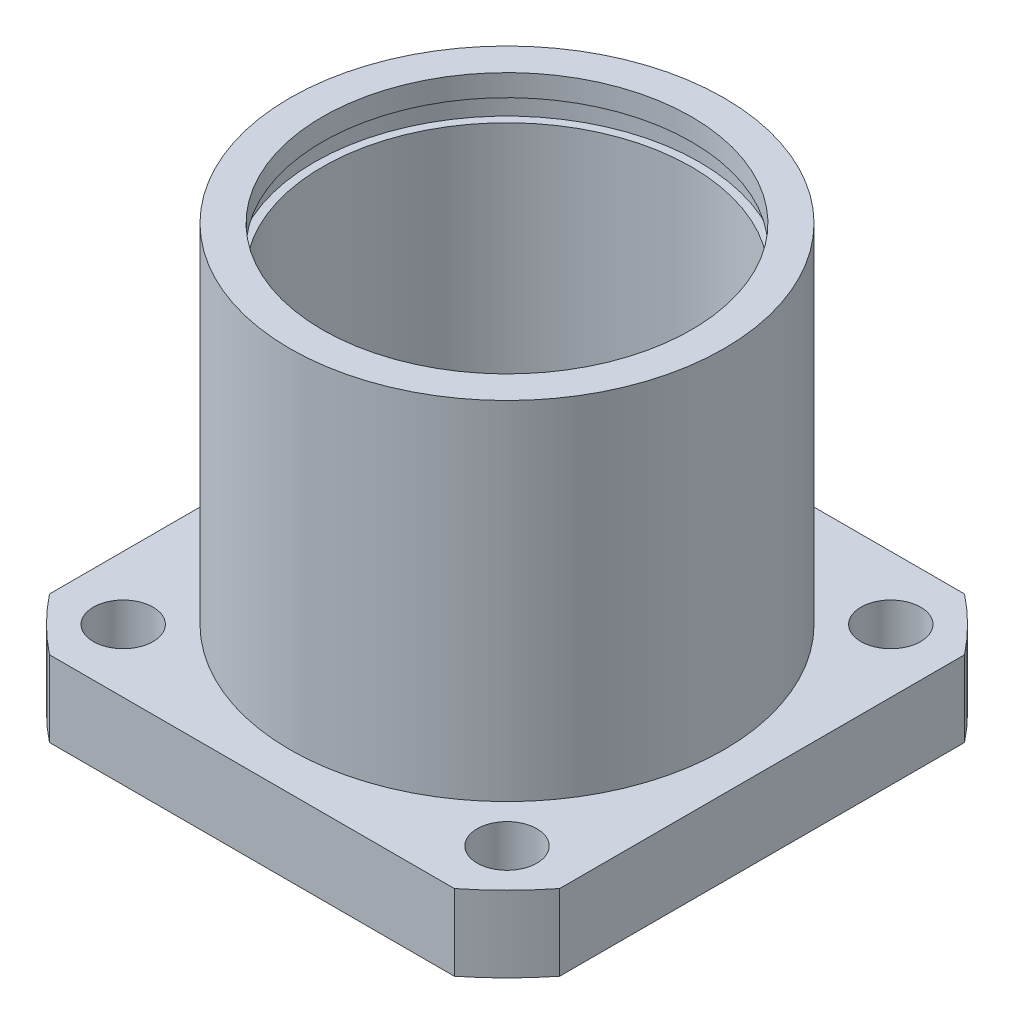
ISO-10303-21;
HEADER;
FILE_DESCRIPTION(('STEP AP214'),'2;1');
FILE_NAME('part.step','',(''),(''),'','','');
FILE_SCHEMA(('AUTOMOTIVE_DESIGN { 1 0 10303 214 1 1 1 1 }'));
ENDSEC;
DATA;
#1=APPLICATION_CONTEXT('core data for automotive mechanical design processes');
#2=APPLICATION_PROTOCOL_DEFINITION('international standard','automotive_design',2000,#1);
#3=PRODUCT_CONTEXT('',#1,'mechanical');
#4=PRODUCT('Part','Part','',(#3));
#5=PRODUCT_RELATED_PRODUCT_CATEGORY('part','',(#4));
#6=PRODUCT_DEFINITION_FORMATION('','',#4);
#7=PRODUCT_DEFINITION_CONTEXT('part definition',#1,'design');
#8=PRODUCT_DEFINITION('design','',#6,#7);
#9=PRODUCT_DEFINITION_SHAPE('','',#8);
#10=(LENGTH_UNIT() NAMED_UNIT(*) SI_UNIT(.MILLI.,.METRE.));
#11=(NAMED_UNIT(*) PLANE_ANGLE_UNIT() SI_UNIT($,.RADIAN.));
#12=(NAMED_UNIT(*) SI_UNIT($,.STERADIAN.) SOLID_ANGLE_UNIT());
#13=UNCERTAINTY_MEASURE_WITH_UNIT(LENGTH_MEASURE(1.E-05),#10,'distance_accuracy_value','');
#14=(GEOMETRIC_REPRESENTATION_CONTEXT(3) GLOBAL_UNCERTAINTY_ASSIGNED_CONTEXT((#13)) GLOBAL_UNIT_ASSIGNED_CONTEXT((#10,
#11,#12)) REPRESENTATION_CONTEXT('',''));
#15=CARTESIAN_POINT('',(0.,0.,0.));
#16=DIRECTION('',(0.,0.,1.));
#17=DIRECTION('',(1.,0.,0.));
#18=AXIS2_PLACEMENT_3D('',#15,#16,#17);
#19=CARTESIAN_POINT('',(21.5,0.999999999999999,-1.50133697570255E-13));
#20=DIRECTION('',(0.,-1.,0.));
#21=DIRECTION('',(0.,0.,-1.));
#22=AXIS2_PLACEMENT_3D('',#19,#20,#21);
#23=PLANE('',#22);
#24=CARTESIAN_POINT('',(-17.6776695296636,0.999999999999999,17.6776695296638));
#25=DIRECTION('',(0.,-1.,0.));
#26=DIRECTION('',(0.,0.,-1.));
#27=AXIS2_PLACEMENT_3D('',#24,#25,#26);
#28=CIRCLE('',#27,2.75);
#29=CARTESIAN_POINT('',(-17.6776695296636,0.999999999999999,14.9276695296638));
#30=VERTEX_POINT('',#29);
#31=EDGE_CURVE('E185',#30,#30,#28,.T.);
#32=ORIENTED_EDGE('',*,*,#31,.F.);
#33=EDGE_LOOP('',(#32));
#34=FACE_BOUND('',#33,.T.);
#35=CARTESIAN_POINT('',(17.6776695296636,0.999999999999999,-17.6776695296638));
#36=DIRECTION('',(0.,-1.,0.));
#37=DIRECTION('',(0.,0.,-1.));
#38=AXIS2_PLACEMENT_3D('',#35,#36,#37);
#39=CIRCLE('',#38,2.75);
#40=CARTESIAN_POINT('',(17.6776695296636,0.999999999999999,-20.4276695296638));
#41=VERTEX_POINT('',#40);
#42=EDGE_CURVE('E182',#41,#41,#39,.T.);
#43=ORIENTED_EDGE('',*,*,#42,.F.);
#44=EDGE_LOOP('',(#43));
#45=FACE_BOUND('',#44,.T.);
#46=CARTESIAN_POINT('',(17.6776695296636,0.999999999999999,17.6776695296638));
#47=DIRECTION('',(0.,-1.,0.));
#48=DIRECTION('',(0.,0.,-1.));
#49=AXIS2_PLACEMENT_3D('',#46,#47,#48);
#50=CIRCLE('',#49,2.75);
#51=CARTESIAN_POINT('',(17.6776695296636,0.999999999999999,14.9276695296638));
#52=VERTEX_POINT('',#51);
#53=EDGE_CURVE('E179',#52,#52,#50,.T.);
#54=ORIENTED_EDGE('',*,*,#53,.F.);
#55=EDGE_LOOP('',(#54));
#56=FACE_BOUND('',#55,.T.);
#57=CARTESIAN_POINT('',(-17.6776695296636,0.999999999999999,-17.6776695296638));
#58=DIRECTION('',(0.,-1.,0.));
#59=DIRECTION('',(0.,0.,-1.));
#60=AXIS2_PLACEMENT_3D('',#57,#58,#59);
#61=CIRCLE('',#60,2.75);
#62=CARTESIAN_POINT('',(-17.6776695296636,0.999999999999999,-20.4276695296638));
#63=VERTEX_POINT('',#62);
#64=EDGE_CURVE('E176',#63,#63,#61,.T.);
#65=ORIENTED_EDGE('',*,*,#64,.F.);
#66=EDGE_LOOP('',(#65));
#67=FACE_BOUND('',#66,.T.);
#68=CARTESIAN_POINT('',(0.,1.,0.));
#69=DIRECTION('',(0.,1.,0.));
#70=DIRECTION('',(0.,0.,1.));
#71=AXIS2_PLACEMENT_3D('',#68,#69,#70);
#72=CIRCLE('',#71,21.5);
#73=CARTESIAN_POINT('',(0.,1.,21.5));
#74=VERTEX_POINT('',#73);
#75=EDGE_CURVE('E279',#74,#74,#72,.T.);
#76=ORIENTED_EDGE('',*,*,#75,.T.);
#77=EDGE_LOOP('',(#76));
#78=FACE_BOUND('',#77,.T.);
#79=CARTESIAN_POINT('',(0.,1.,0.));
#80=DIRECTION('',(0.,1.,0.));
#81=DIRECTION('',(0.,0.,1.));
#82=AXIS2_PLACEMENT_3D('',#79,#80,#81);
#83=CIRCLE('',#82,30.);
#84=CARTESIAN_POINT('',(-23.5,1.,18.6480561989715));
#85=VERTEX_POINT('',#84);
#86=CARTESIAN_POINT('',(-18.6480561989715,1.,23.5));
#87=VERTEX_POINT('',#86);
#88=EDGE_CURVE('E119',#85,#87,#83,.T.);
#89=ORIENTED_EDGE('',*,*,#88,.F.);
#90=DIRECTION('',(0.,0.,-1.));
#91=VECTOR('',#90,1.);
#92=CARTESIAN_POINT('',(-23.5,0.999999999999999,-1.43490075747365E-13));
#93=LINE('',#92,#91);
#94=CARTESIAN_POINT('',(-23.5,1.,-18.6480561989715));
#95=VERTEX_POINT('',#94);
#96=EDGE_CURVE('E160',#85,#95,#93,.T.);
#97=ORIENTED_EDGE('',*,*,#96,.T.);
#98=CARTESIAN_POINT('',(-18.6480561989715,1.,-23.5));
#99=VERTEX_POINT('',#98);
#100=EDGE_CURVE('E134',#99,#95,#83,.T.);
#101=ORIENTED_EDGE('',*,*,#100,.F.);
#102=DIRECTION('',(1.,0.,0.));
#103=VECTOR('',#102,1.);
#104=CARTESIAN_POINT('',(21.5,0.999999999999999,-23.5));
#105=LINE('',#104,#103);
#106=CARTESIAN_POINT('',(18.6480561989715,1.,-23.5));
#107=VERTEX_POINT('',#106);
#108=EDGE_CURVE('E149',#99,#107,#105,.T.);
#109=ORIENTED_EDGE('',*,*,#108,.T.);
#110=CARTESIAN_POINT('',(23.5,1.,-18.6480561989715));
#111=VERTEX_POINT('',#110);
#112=EDGE_CURVE('E147',#111,#107,#83,.T.);
#113=ORIENTED_EDGE('',*,*,#112,.F.);
#114=DIRECTION('',(0.,0.,1.));
#115=VECTOR('',#114,1.);
#116=CARTESIAN_POINT('',(23.5,0.999999999999999,-1.50428969651272E-13));
#117=LINE('',#116,#115);
#118=CARTESIAN_POINT('',(23.5,1.,18.6480561989715));
#119=VERTEX_POINT('',#118);
#120=EDGE_CURVE('E152',#111,#119,#117,.T.);
#121=ORIENTED_EDGE('',*,*,#120,.T.);
#122=CARTESIAN_POINT('',(18.6480561989715,1.,23.5));
#123=VERTEX_POINT('',#122);
#124=EDGE_CURVE('E135',#123,#119,#83,.T.);
#125=ORIENTED_EDGE('',*,*,#124,.F.);
#126=DIRECTION('',(-1.,0.,0.));
#127=VECTOR('',#126,1.);
#128=CARTESIAN_POINT('',(21.5,0.999999999999999,23.5));
#129=LINE('',#128,#127);
#130=EDGE_CURVE('E120',#123,#87,#129,.T.);
#131=ORIENTED_EDGE('',*,*,#130,.T.);
#132=EDGE_LOOP('',(#89,#97,#101,#109,#113,#121,#125,#131));
#133=FACE_BOUND('',#132,.T.);
#134=ADVANCED_FACE('F36',(#34,#45,#56,#67,#78,#133),#23,.T.);
#135=CARTESIAN_POINT('',(0.,50.2605362226467,0.));
#136=DIRECTION('',(0.,1.,0.));
#137=DIRECTION('',(0.,0.,1.));
#138=AXIS2_PLACEMENT_3D('',#135,#136,#137);
#139=CYLINDRICAL_SURFACE('',#138,30.);
#140=CARTESIAN_POINT('',(0.,8.,0.));
#141=DIRECTION('',(0.,1.,0.));
#142=DIRECTION('',(0.,0.,1.));
#143=AXIS2_PLACEMENT_3D('',#140,#141,#142);
#144=CIRCLE('',#143,30.);
#145=CARTESIAN_POINT('',(-23.5,8.,18.6480561989715));
#146=VERTEX_POINT('',#145);
#147=CARTESIAN_POINT('',(-18.6480561989715,8.,23.5));
#148=VERTEX_POINT('',#147);
#149=EDGE_CURVE('E117',#146,#148,#144,.T.);
#150=ORIENTED_EDGE('',*,*,#149,.F.);
#151=DIRECTION('',(0.,1.,0.));
#152=VECTOR('',#151,1.);
#153=CARTESIAN_POINT('',(-23.5,50.2605362226467,18.6480561989715));
#154=LINE('',#153,#152);
#155=EDGE_CURVE('E51',#146,#85,#154,.F.);
#156=ORIENTED_EDGE('',*,*,#155,.T.);
#157=ORIENTED_EDGE('',*,*,#88,.T.);
#158=DIRECTION('',(0.,1.,0.));
#159=VECTOR('',#158,1.);
#160=CARTESIAN_POINT('',(-18.6480561989715,50.2605362226467,23.5));
#161=LINE('',#160,#159);
#162=EDGE_CURVE('E102',#87,#148,#161,.T.);
#163=ORIENTED_EDGE('',*,*,#162,.T.);
#164=EDGE_LOOP('',(#150,#156,#157,#163));
#165=FACE_BOUND('',#164,.T.);
#166=ADVANCED_FACE('F116',(#165),#139,.T.);
#167=ORIENTED_EDGE('',*,*,#100,.T.);
#168=DIRECTION('',(0.,1.,0.));
#169=VECTOR('',#168,1.);
#170=CARTESIAN_POINT('',(-23.5,50.2605362226467,-18.6480561989715));
#171=LINE('',#170,#169);
#172=CARTESIAN_POINT('',(-23.5,8.,-18.6480561989715));
#173=VERTEX_POINT('',#172);
#174=EDGE_CURVE('E157',#95,#173,#171,.T.);
#175=ORIENTED_EDGE('',*,*,#174,.T.);
#176=CARTESIAN_POINT('',(-18.6480561989715,8.,-23.5));
#177=VERTEX_POINT('',#176);
#178=EDGE_CURVE('E124',#177,#173,#144,.T.);
#179=ORIENTED_EDGE('',*,*,#178,.F.);
#180=DIRECTION('',(0.,1.,0.));
#181=VECTOR('',#180,1.);
#182=CARTESIAN_POINT('',(-18.6480561989715,50.2605362226467,-23.5));
#183=LINE('',#182,#181);
#184=EDGE_CURVE('E58',#177,#99,#183,.F.);
#185=ORIENTED_EDGE('',*,*,#184,.T.);
#186=EDGE_LOOP('',(#167,#175,#179,#185));
#187=FACE_BOUND('',#186,.T.);
#188=ADVANCED_FACE('F230',(#187),#139,.T.);
#189=ORIENTED_EDGE('',*,*,#112,.T.);
#190=DIRECTION('',(0.,1.,0.));
#191=VECTOR('',#190,1.);
#192=CARTESIAN_POINT('',(18.6480561989715,50.2605362226467,-23.5));
#193=LINE('',#192,#191);
#194=CARTESIAN_POINT('',(18.6480561989715,8.,-23.5));
#195=VERTEX_POINT('',#194);
#196=EDGE_CURVE('E146',#107,#195,#193,.T.);
#197=ORIENTED_EDGE('',*,*,#196,.T.);
#198=CARTESIAN_POINT('',(23.5,8.,-18.6480561989715));
#199=VERTEX_POINT('',#198);
#200=EDGE_CURVE('E128',#199,#195,#144,.T.);
#201=ORIENTED_EDGE('',*,*,#200,.F.);
#202=DIRECTION('',(0.,1.,0.));
#203=VECTOR('',#202,1.);
#204=CARTESIAN_POINT('',(23.5,50.2605362226467,-18.6480561989715));
#205=LINE('',#204,#203);
#206=EDGE_CURVE('E144',#199,#111,#205,.F.);
#207=ORIENTED_EDGE('',*,*,#206,.T.);
#208=EDGE_LOOP('',(#189,#197,#201,#207));
#209=FACE_BOUND('',#208,.T.);
#210=ADVANCED_FACE('F143',(#209),#139,.T.);
#211=ORIENTED_EDGE('',*,*,#124,.T.);
#212=DIRECTION('',(0.,1.,0.));
#213=VECTOR('',#212,1.);
#214=CARTESIAN_POINT('',(23.5,50.2605362226467,18.6480561989715));
#215=LINE('',#214,#213);
#216=CARTESIAN_POINT('',(23.5,8.,18.6480561989715));
#217=VERTEX_POINT('',#216);
#218=EDGE_CURVE('E516',#119,#217,#215,.T.);
#219=ORIENTED_EDGE('',*,*,#218,.T.);
#220=CARTESIAN_POINT('',(18.6480561989715,8.,23.5));
#221=VERTEX_POINT('',#220);
#222=EDGE_CURVE('E127',#221,#217,#144,.T.);
#223=ORIENTED_EDGE('',*,*,#222,.F.);
#224=DIRECTION('',(0.,1.,0.));
#225=VECTOR('',#224,1.);
#226=CARTESIAN_POINT('',(18.6480561989715,50.2605362226467,23.5));
#227=LINE('',#226,#225);
#228=EDGE_CURVE('E105',#221,#123,#227,.F.);
#229=ORIENTED_EDGE('',*,*,#228,.T.);
#230=EDGE_LOOP('',(#211,#219,#223,#229));
#231=FACE_BOUND('',#230,.T.);
#232=ADVANCED_FACE('F232',(#231),#139,.T.);
#233=CARTESIAN_POINT('',(30.,8.,-2.09488880330588E-13));
#234=DIRECTION('',(0.,1.,0.));
#235=DIRECTION('',(0.,0.,1.));
#236=AXIS2_PLACEMENT_3D('',#233,#234,#235);
#237=PLANE('',#236);
#238=CARTESIAN_POINT('',(-17.6776695296636,8.,17.6776695296638));
#239=DIRECTION('',(0.,1.,0.));
#240=DIRECTION('',(0.,0.,1.));
#241=AXIS2_PLACEMENT_3D('',#238,#239,#240);
#242=CIRCLE('',#241,2.75);
#243=CARTESIAN_POINT('',(-17.6776695296636,8.,20.4276695296638));
#244=VERTEX_POINT('',#243);
#245=EDGE_CURVE('E168',#244,#244,#242,.T.);
#246=ORIENTED_EDGE('',*,*,#245,.F.);
#247=EDGE_LOOP('',(#246));
#248=FACE_BOUND('',#247,.T.);
#249=CARTESIAN_POINT('',(17.6776695296636,8.,-17.6776695296638));
#250=DIRECTION('',(0.,1.,0.));
#251=DIRECTION('',(0.,0.,1.));
#252=AXIS2_PLACEMENT_3D('',#249,#250,#251);
#253=CIRCLE('',#252,2.75);
#254=CARTESIAN_POINT('',(17.6776695296636,8.,-14.9276695296638));
#255=VERTEX_POINT('',#254);
#256=EDGE_CURVE('E167',#255,#255,#253,.T.);
#257=ORIENTED_EDGE('',*,*,#256,.F.);
#258=EDGE_LOOP('',(#257));
#259=FACE_BOUND('',#258,.T.);
#260=CARTESIAN_POINT('',(17.6776695296636,8.,17.6776695296638));
#261=DIRECTION('',(0.,1.,0.));
#262=DIRECTION('',(0.,0.,1.));
#263=AXIS2_PLACEMENT_3D('',#260,#261,#262);
#264=CIRCLE('',#263,2.75);
#265=CARTESIAN_POINT('',(17.6776695296636,8.,20.4276695296638));
#266=VERTEX_POINT('',#265);
#267=EDGE_CURVE('E164',#266,#266,#264,.T.);
#268=ORIENTED_EDGE('',*,*,#267,.F.);
#269=EDGE_LOOP('',(#268));
#270=FACE_BOUND('',#269,.T.);
#271=CARTESIAN_POINT('',(-17.6776695296636,8.,-17.6776695296638));
#272=DIRECTION('',(0.,1.,0.));
#273=DIRECTION('',(0.,0.,1.));
#274=AXIS2_PLACEMENT_3D('',#271,#272,#273);
#275=CIRCLE('',#274,2.75);
#276=CARTESIAN_POINT('',(-17.6776695296636,8.,-14.9276695296638));
#277=VERTEX_POINT('',#276);
#278=EDGE_CURVE('E171',#277,#277,#275,.T.);
#279=ORIENTED_EDGE('',*,*,#278,.F.);
#280=EDGE_LOOP('',(#279));
#281=FACE_BOUND('',#280,.T.);
#282=CARTESIAN_POINT('',(0.,8.,0.));
#283=DIRECTION('',(0.,1.,0.));
#284=DIRECTION('',(0.,0.,1.));
#285=AXIS2_PLACEMENT_3D('',#282,#283,#284);
#286=CIRCLE('',#285,20.);
#287=CARTESIAN_POINT('',(0.,8.,20.));
#288=VERTEX_POINT('',#287);
#289=EDGE_CURVE('E125',#288,#288,#286,.T.);
#290=ORIENTED_EDGE('',*,*,#289,.F.);
#291=EDGE_LOOP('',(#290));
#292=FACE_BOUND('',#291,.T.);
#293=ORIENTED_EDGE('',*,*,#178,.T.);
#294=DIRECTION('',(0.,0.,1.));
#295=VECTOR('',#294,1.);
#296=CARTESIAN_POINT('',(-23.5,8.,-2.01590352163374E-13));
#297=LINE('',#296,#295);
#298=EDGE_CURVE('E12',#173,#146,#297,.T.);
#299=ORIENTED_EDGE('',*,*,#298,.T.);
#300=ORIENTED_EDGE('',*,*,#149,.T.);
#301=DIRECTION('',(1.,0.,0.));
#302=VECTOR('',#301,1.);
#303=CARTESIAN_POINT('',(30.,8.,23.5));
#304=LINE('',#303,#302);
#305=EDGE_CURVE('E99',#148,#221,#304,.T.);
#306=ORIENTED_EDGE('',*,*,#305,.T.);
#307=ORIENTED_EDGE('',*,*,#222,.T.);
#308=DIRECTION('',(0.,0.,-1.));
#309=VECTOR('',#308,1.);
#310=CARTESIAN_POINT('',(23.5,8.,-2.08529246067282E-13));
#311=LINE('',#310,#309);
#312=EDGE_CURVE('E110',#217,#199,#311,.T.);
#313=ORIENTED_EDGE('',*,*,#312,.T.);
#314=ORIENTED_EDGE('',*,*,#200,.T.);
#315=DIRECTION('',(-1.,0.,0.));
#316=VECTOR('',#315,1.);
#317=CARTESIAN_POINT('',(30.,8.,-23.5));
#318=LINE('',#317,#316);
#319=EDGE_CURVE('E44',#195,#177,#318,.T.);
#320=ORIENTED_EDGE('',*,*,#319,.T.);
#321=EDGE_LOOP('',(#293,#299,#300,#306,#307,#313,#314,#320));
#322=FACE_BOUND('',#321,.T.);
#323=ADVANCED_FACE('F123',(#248,#259,#270,#281,#292,#322),#237,.T.);
#324=CARTESIAN_POINT('',(0.,50.2605362226467,0.));
#325=DIRECTION('',(0.,1.,0.));
#326=DIRECTION('',(0.,0.,1.));
#327=AXIS2_PLACEMENT_3D('',#324,#325,#326);
#328=CYLINDRICAL_SURFACE('',#327,17.);
#329=CARTESIAN_POINT('',(0.,36.,0.));
#330=DIRECTION('',(0.,1.,0.));
#331=DIRECTION('',(0.,0.,1.));
#332=AXIS2_PLACEMENT_3D('',#329,#330,#331);
#333=CIRCLE('',#332,17.);
#334=CARTESIAN_POINT('',(0.,36.,17.));
#335=VERTEX_POINT('',#334);
#336=EDGE_CURVE('E188',#335,#335,#333,.T.);
#337=ORIENTED_EDGE('',*,*,#336,.T.);
#338=EDGE_LOOP('',(#337));
#339=FACE_BOUND('',#338,.T.);
#340=CARTESIAN_POINT('',(0.,4.,0.));
#341=DIRECTION('',(0.,1.,0.));
#342=DIRECTION('',(0.,0.,1.));
#343=AXIS2_PLACEMENT_3D('',#340,#341,#342);
#344=CIRCLE('',#343,17.);
#345=CARTESIAN_POINT('',(0.,4.,17.));
#346=VERTEX_POINT('',#345);
#347=EDGE_CURVE('E111',#346,#346,#344,.T.);
#348=ORIENTED_EDGE('',*,*,#347,.F.);
#349=EDGE_LOOP('',(#348));
#350=FACE_BOUND('',#349,.T.);
#351=ADVANCED_FACE('F38',(#339,#350),#328,.F.);
#352=CARTESIAN_POINT('',(17.,4.,-1.18710365520667E-13));
#353=DIRECTION('',(0.,-1.,0.));
#354=DIRECTION('',(0.,0.,-1.));
#355=AXIS2_PLACEMENT_3D('',#352,#353,#354);
#356=PLANE('',#355);
#357=ORIENTED_EDGE('',*,*,#347,.T.);
#358=EDGE_LOOP('',(#357));
#359=FACE_BOUND('',#358,.T.);
#360=CARTESIAN_POINT('',(0.,4.,0.));
#361=DIRECTION('',(0.,1.,0.));
#362=DIRECTION('',(0.,0.,1.));
#363=AXIS2_PLACEMENT_3D('',#360,#361,#362);
#364=CIRCLE('',#363,17.75);
#365=CARTESIAN_POINT('',(0.,4.,17.75));
#366=VERTEX_POINT('',#365);
#367=EDGE_CURVE('E262',#366,#366,#364,.T.);
#368=ORIENTED_EDGE('',*,*,#367,.F.);
#369=EDGE_LOOP('',(#368));
#370=FACE_BOUND('',#369,.T.);
#371=ADVANCED_FACE('F249',(#359,#370),#356,.T.);
#372=CARTESIAN_POINT('',(0.,50.2605362226467,0.));
#373=DIRECTION('',(0.,1.,0.));
#374=DIRECTION('',(0.,0.,1.));
#375=AXIS2_PLACEMENT_3D('',#372,#373,#374);
#376=CYLINDRICAL_SURFACE('',#375,17.75);
#377=ORIENTED_EDGE('',*,*,#367,.T.);
#378=EDGE_LOOP('',(#377));
#379=FACE_BOUND('',#378,.T.);
#380=CARTESIAN_POINT('',(0.,2.,0.));
#381=DIRECTION('',(0.,1.,0.));
#382=DIRECTION('',(0.,0.,1.));
#383=AXIS2_PLACEMENT_3D('',#380,#381,#382);
#384=CIRCLE('',#383,17.75);
#385=CARTESIAN_POINT('',(0.,2.,17.75));
#386=VERTEX_POINT('',#385);
#387=EDGE_CURVE('E263',#386,#386,#384,.T.);
#388=ORIENTED_EDGE('',*,*,#387,.F.);
#389=EDGE_LOOP('',(#388));
#390=FACE_BOUND('',#389,.T.);
#391=ADVANCED_FACE('F246',(#379,#390),#376,.F.);
#392=CARTESIAN_POINT('',(17.75,2.,-1.23947587528931E-13));
#393=DIRECTION('',(0.,1.,0.));
#394=DIRECTION('',(0.,0.,1.));
#395=AXIS2_PLACEMENT_3D('',#392,#393,#394);
#396=PLANE('',#395);
#397=ORIENTED_EDGE('',*,*,#387,.T.);
#398=EDGE_LOOP('',(#397));
#399=FACE_BOUND('',#398,.T.);
#400=CARTESIAN_POINT('',(0.,2.,0.));
#401=DIRECTION('',(0.,1.,0.));
#402=DIRECTION('',(0.,0.,1.));
#403=AXIS2_PLACEMENT_3D('',#400,#401,#402);
#404=CIRCLE('',#403,17.);
#405=CARTESIAN_POINT('',(0.,2.,17.));
#406=VERTEX_POINT('',#405);
#407=EDGE_CURVE('E267',#406,#406,#404,.T.);
#408=ORIENTED_EDGE('',*,*,#407,.F.);
#409=EDGE_LOOP('',(#408));
#410=FACE_BOUND('',#409,.T.);
#411=ADVANCED_FACE('F242',(#399,#410),#396,.T.);
#412=CARTESIAN_POINT('',(0.,50.2605362226467,0.));
#413=DIRECTION('',(0.,1.,0.));
#414=DIRECTION('',(0.,0.,1.));
#415=AXIS2_PLACEMENT_3D('',#412,#413,#414);
#416=CYLINDRICAL_SURFACE('',#415,17.);
#417=ORIENTED_EDGE('',*,*,#407,.T.);
#418=EDGE_LOOP('',(#417));
#419=FACE_BOUND('',#418,.T.);
#420=CARTESIAN_POINT('',(0.,0.,0.));
#421=DIRECTION('',(0.,1.,0.));
#422=DIRECTION('',(0.,0.,1.));
#423=AXIS2_PLACEMENT_3D('',#420,#421,#422);
#424=CIRCLE('',#423,17.);
#425=CARTESIAN_POINT('',(0.,0.,17.));
#426=VERTEX_POINT('',#425);
#427=EDGE_CURVE('E273',#426,#426,#424,.T.);
#428=ORIENTED_EDGE('',*,*,#427,.F.);
#429=EDGE_LOOP('',(#428));
#430=FACE_BOUND('',#429,.T.);
#431=ADVANCED_FACE('F238',(#419,#430),#416,.F.);
#432=CARTESIAN_POINT('',(17.,0.,-1.18710365520667E-13));
#433=DIRECTION('',(0.,-1.,0.));
#434=DIRECTION('',(0.,0.,-1.));
#435=AXIS2_PLACEMENT_3D('',#432,#433,#434);
#436=PLANE('',#435);
#437=ORIENTED_EDGE('',*,*,#427,.T.);
#438=EDGE_LOOP('',(#437));
#439=FACE_BOUND('',#438,.T.);
#440=CARTESIAN_POINT('',(0.,0.,0.));
#441=DIRECTION('',(0.,1.,0.));
#442=DIRECTION('',(0.,0.,1.));
#443=AXIS2_PLACEMENT_3D('',#440,#441,#442);
#444=CIRCLE('',#443,21.5);
#445=CARTESIAN_POINT('',(0.,0.,21.5));
#446=VERTEX_POINT('',#445);
#447=EDGE_CURVE('E276',#446,#446,#444,.T.);
#448=ORIENTED_EDGE('',*,*,#447,.F.);
#449=EDGE_LOOP('',(#448));
#450=FACE_BOUND('',#449,.T.);
#451=ADVANCED_FACE('F220',(#439,#450),#436,.T.);
#452=CARTESIAN_POINT('',(0.,50.2605362226467,0.));
#453=DIRECTION('',(0.,1.,0.));
#454=DIRECTION('',(0.,0.,1.));
#455=AXIS2_PLACEMENT_3D('',#452,#453,#454);
#456=CYLINDRICAL_SURFACE('',#455,21.5);
#457=ORIENTED_EDGE('',*,*,#447,.T.);
#458=EDGE_LOOP('',(#457));
#459=FACE_BOUND('',#458,.T.);
#460=ORIENTED_EDGE('',*,*,#75,.F.);
#461=EDGE_LOOP('',(#460));
#462=FACE_BOUND('',#461,.T.);
#463=ADVANCED_FACE('F211',(#459,#462),#456,.T.);
#464=CARTESIAN_POINT('',(0.,50.2605362226467,0.));
#465=DIRECTION('',(0.,1.,0.));
#466=DIRECTION('',(0.,0.,1.));
#467=AXIS2_PLACEMENT_3D('',#464,#465,#466);
#468=CYLINDRICAL_SURFACE('',#467,20.);
#469=ORIENTED_EDGE('',*,*,#289,.T.);
#470=EDGE_LOOP('',(#469));
#471=FACE_BOUND('',#470,.T.);
#472=CARTESIAN_POINT('',(0.,40.,0.));
#473=DIRECTION('',(0.,1.,0.));
#474=DIRECTION('',(0.,0.,1.));
#475=AXIS2_PLACEMENT_3D('',#472,#473,#474);
#476=CIRCLE('',#475,20.);
#477=CARTESIAN_POINT('',(0.,40.,20.));
#478=VERTEX_POINT('',#477);
#479=EDGE_CURVE('E130',#478,#478,#476,.T.);
#480=ORIENTED_EDGE('',*,*,#479,.F.);
#481=EDGE_LOOP('',(#480));
#482=FACE_BOUND('',#481,.T.);
#483=ADVANCED_FACE('F209',(#471,#482),#468,.T.);
#484=CARTESIAN_POINT('',(20.,40.,-1.39659253553725E-13));
#485=DIRECTION('',(0.,1.,0.));
#486=DIRECTION('',(0.,0.,1.));
#487=AXIS2_PLACEMENT_3D('',#484,#485,#486);
#488=PLANE('',#487);
#489=ORIENTED_EDGE('',*,*,#479,.T.);
#490=EDGE_LOOP('',(#489));
#491=FACE_BOUND('',#490,.T.);
#492=CARTESIAN_POINT('',(0.,40.,0.));
#493=DIRECTION('',(0.,1.,0.));
#494=DIRECTION('',(0.,0.,1.));
#495=AXIS2_PLACEMENT_3D('',#492,#493,#494);
#496=CIRCLE('',#495,17.);
#497=CARTESIAN_POINT('',(0.,40.,17.));
#498=VERTEX_POINT('',#497);
#499=EDGE_CURVE('E200',#498,#498,#496,.T.);
#500=ORIENTED_EDGE('',*,*,#499,.F.);
#501=EDGE_LOOP('',(#500));
#502=FACE_BOUND('',#501,.T.);
#503=ADVANCED_FACE('F206',(#491,#502),#488,.T.);
#504=CARTESIAN_POINT('',(0.,50.2605362226467,0.));
#505=DIRECTION('',(0.,1.,0.));
#506=DIRECTION('',(0.,0.,1.));
#507=AXIS2_PLACEMENT_3D('',#504,#505,#506);
#508=CYLINDRICAL_SURFACE('',#507,17.);
#509=ORIENTED_EDGE('',*,*,#499,.T.);
#510=EDGE_LOOP('',(#509));
#511=FACE_BOUND('',#510,.T.);
#512=CARTESIAN_POINT('',(0.,38.,0.));
#513=DIRECTION('',(0.,1.,0.));
#514=DIRECTION('',(0.,0.,1.));
#515=AXIS2_PLACEMENT_3D('',#512,#513,#514);
#516=CIRCLE('',#515,17.);
#517=CARTESIAN_POINT('',(0.,38.,17.));
#518=VERTEX_POINT('',#517);
#519=EDGE_CURVE('E197',#518,#518,#516,.T.);
#520=ORIENTED_EDGE('',*,*,#519,.F.);
#521=EDGE_LOOP('',(#520));
#522=FACE_BOUND('',#521,.T.);
#523=ADVANCED_FACE('F218',(#511,#522),#508,.F.);
#524=CARTESIAN_POINT('',(17.,38.,-1.18710365520667E-13));
#525=DIRECTION('',(0.,-1.,0.));
#526=DIRECTION('',(0.,0.,-1.));
#527=AXIS2_PLACEMENT_3D('',#524,#525,#526);
#528=PLANE('',#527);
#529=ORIENTED_EDGE('',*,*,#519,.T.);
#530=EDGE_LOOP('',(#529));
#531=FACE_BOUND('',#530,.T.);
#532=CARTESIAN_POINT('',(0.,38.,0.));
#533=DIRECTION('',(0.,1.,0.));
#534=DIRECTION('',(0.,0.,1.));
#535=AXIS2_PLACEMENT_3D('',#532,#533,#534);
#536=CIRCLE('',#535,17.75);
#537=CARTESIAN_POINT('',(0.,38.,17.75));
#538=VERTEX_POINT('',#537);
#539=EDGE_CURVE('E194',#538,#538,#536,.T.);
#540=ORIENTED_EDGE('',*,*,#539,.F.);
#541=EDGE_LOOP('',(#540));
#542=FACE_BOUND('',#541,.T.);
#543=ADVANCED_FACE('F324',(#531,#542),#528,.T.);
#544=CARTESIAN_POINT('',(0.,50.2605362226467,0.));
#545=DIRECTION('',(0.,1.,0.));
#546=DIRECTION('',(0.,0.,1.));
#547=AXIS2_PLACEMENT_3D('',#544,#545,#546);
#548=CYLINDRICAL_SURFACE('',#547,17.75);
#549=ORIENTED_EDGE('',*,*,#539,.T.);
#550=EDGE_LOOP('',(#549));
#551=FACE_BOUND('',#550,.T.);
#552=CARTESIAN_POINT('',(0.,36.,0.));
#553=DIRECTION('',(0.,1.,0.));
#554=DIRECTION('',(0.,0.,1.));
#555=AXIS2_PLACEMENT_3D('',#552,#553,#554);
#556=CIRCLE('',#555,17.75);
#557=CARTESIAN_POINT('',(0.,36.,17.75));
#558=VERTEX_POINT('',#557);
#559=EDGE_CURVE('E191',#558,#558,#556,.T.);
#560=ORIENTED_EDGE('',*,*,#559,.F.);
#561=EDGE_LOOP('',(#560));
#562=FACE_BOUND('',#561,.T.);
#563=ADVANCED_FACE('F320',(#551,#562),#548,.F.);
#564=CARTESIAN_POINT('',(17.75,36.,-1.23947587528931E-13));
#565=DIRECTION('',(0.,1.,0.));
#566=DIRECTION('',(0.,0.,1.));
#567=AXIS2_PLACEMENT_3D('',#564,#565,#566);
#568=PLANE('',#567);
#569=ORIENTED_EDGE('',*,*,#559,.T.);
#570=EDGE_LOOP('',(#569));
#571=FACE_BOUND('',#570,.T.);
#572=ORIENTED_EDGE('',*,*,#336,.F.);
#573=EDGE_LOOP('',(#572));
#574=FACE_BOUND('',#573,.T.);
#575=ADVANCED_FACE('F316',(#571,#574),#568,.T.);
#576=CARTESIAN_POINT('',(-17.6776695296636,0.,-17.6776695296638));
#577=DIRECTION('',(0.,1.,0.));
#578=DIRECTION('',(0.,0.,1.));
#579=AXIS2_PLACEMENT_3D('',#576,#577,#578);
#580=CYLINDRICAL_SURFACE('',#579,2.75);
#581=ORIENTED_EDGE('',*,*,#64,.T.);
#582=EDGE_LOOP('',(#581));
#583=FACE_BOUND('',#582,.T.);
#584=ORIENTED_EDGE('',*,*,#278,.T.);
#585=EDGE_LOOP('',(#584));
#586=FACE_BOUND('',#585,.T.);
#587=ADVANCED_FACE('F305',(#583,#586),#580,.F.);
#588=CARTESIAN_POINT('',(17.6776695296636,0.,17.6776695296638));
#589=DIRECTION('',(0.,1.,0.));
#590=DIRECTION('',(0.,0.,1.));
#591=AXIS2_PLACEMENT_3D('',#588,#589,#590);
#592=CYLINDRICAL_SURFACE('',#591,2.75);
#593=ORIENTED_EDGE('',*,*,#53,.T.);
#594=EDGE_LOOP('',(#593));
#595=FACE_BOUND('',#594,.T.);
#596=ORIENTED_EDGE('',*,*,#267,.T.);
#597=EDGE_LOOP('',(#596));
#598=FACE_BOUND('',#597,.T.);
#599=ADVANCED_FACE('F301',(#595,#598),#592,.F.);
#600=CARTESIAN_POINT('',(17.6776695296636,0.,-17.6776695296638));
#601=DIRECTION('',(0.,1.,0.));
#602=DIRECTION('',(0.,0.,1.));
#603=AXIS2_PLACEMENT_3D('',#600,#601,#602);
#604=CYLINDRICAL_SURFACE('',#603,2.75);
#605=ORIENTED_EDGE('',*,*,#42,.T.);
#606=EDGE_LOOP('',(#605));
#607=FACE_BOUND('',#606,.T.);
#608=ORIENTED_EDGE('',*,*,#256,.T.);
#609=EDGE_LOOP('',(#608));
#610=FACE_BOUND('',#609,.T.);
#611=ADVANCED_FACE('F304',(#607,#610),#604,.F.);
#612=CARTESIAN_POINT('',(-17.6776695296636,0.,17.6776695296638));
#613=DIRECTION('',(0.,1.,0.));
#614=DIRECTION('',(0.,0.,1.));
#615=AXIS2_PLACEMENT_3D('',#612,#613,#614);
#616=CYLINDRICAL_SURFACE('',#615,2.75);
#617=ORIENTED_EDGE('',*,*,#31,.T.);
#618=EDGE_LOOP('',(#617));
#619=FACE_BOUND('',#618,.T.);
#620=ORIENTED_EDGE('',*,*,#245,.T.);
#621=EDGE_LOOP('',(#620));
#622=FACE_BOUND('',#621,.T.);
#623=ADVANCED_FACE('F307',(#619,#622),#616,.F.);
#624=CARTESIAN_POINT('',(23.5,0.,23.5));
#625=DIRECTION('',(0.,0.,1.));
#626=DIRECTION('',(1.,0.,0.));
#627=AXIS2_PLACEMENT_3D('',#624,#625,#626);
#628=PLANE('',#627);
#629=ORIENTED_EDGE('',*,*,#305,.F.);
#630=ORIENTED_EDGE('',*,*,#162,.F.);
#631=ORIENTED_EDGE('',*,*,#130,.F.);
#632=ORIENTED_EDGE('',*,*,#228,.F.);
#633=EDGE_LOOP('',(#629,#630,#631,#632));
#634=FACE_BOUND('',#633,.T.);
#635=ADVANCED_FACE('F101',(#634),#628,.T.);
#636=CARTESIAN_POINT('',(23.5,0.,-23.5));
#637=DIRECTION('',(1.,0.,0.));
#638=DIRECTION('',(0.,0.,-1.));
#639=AXIS2_PLACEMENT_3D('',#636,#637,#638);
#640=PLANE('',#639);
#641=ORIENTED_EDGE('',*,*,#312,.F.);
#642=ORIENTED_EDGE('',*,*,#218,.F.);
#643=ORIENTED_EDGE('',*,*,#120,.F.);
#644=ORIENTED_EDGE('',*,*,#206,.F.);
#645=EDGE_LOOP('',(#641,#642,#643,#644));
#646=FACE_BOUND('',#645,.T.);
#647=ADVANCED_FACE('F296',(#646),#640,.T.);
#648=CARTESIAN_POINT('',(23.5,0.,-23.5));
#649=DIRECTION('',(0.,0.,-1.));
#650=DIRECTION('',(-1.,0.,0.));
#651=AXIS2_PLACEMENT_3D('',#648,#649,#650);
#652=PLANE('',#651);
#653=ORIENTED_EDGE('',*,*,#319,.F.);
#654=ORIENTED_EDGE('',*,*,#196,.F.);
#655=ORIENTED_EDGE('',*,*,#108,.F.);
#656=ORIENTED_EDGE('',*,*,#184,.F.);
#657=EDGE_LOOP('',(#653,#654,#655,#656));
#658=FACE_BOUND('',#657,.T.);
#659=ADVANCED_FACE('F291',(#658),#652,.T.);
#660=CARTESIAN_POINT('',(-23.5,0.,-23.5));
#661=DIRECTION('',(-1.,0.,0.));
#662=DIRECTION('',(0.,0.,1.));
#663=AXIS2_PLACEMENT_3D('',#660,#661,#662);
#664=PLANE('',#663);
#665=ORIENTED_EDGE('',*,*,#298,.F.);
#666=ORIENTED_EDGE('',*,*,#174,.F.);
#667=ORIENTED_EDGE('',*,*,#96,.F.);
#668=ORIENTED_EDGE('',*,*,#155,.F.);
#669=EDGE_LOOP('',(#665,#666,#667,#668));
#670=FACE_BOUND('',#669,.T.);
#671=ADVANCED_FACE('F289',(#670),#664,.T.);
#672=CLOSED_SHELL('',(#134,#166,#188,#210,#232,#323,#351,#371,#391,#411,#431,#451,#463,#483,
#503,#523,#543,#563,#575,#587,#599,#611,#623,#635,#647,#659,#671));
#673=MANIFOLD_SOLID_BREP('B2',#672);
#674=ADVANCED_BREP_SHAPE_REPRESENTATION('',(#18,#673),#14);
#675=SHAPE_DEFINITION_REPRESENTATION(#9,#674);
ENDSEC;
END-ISO-10303-21;
